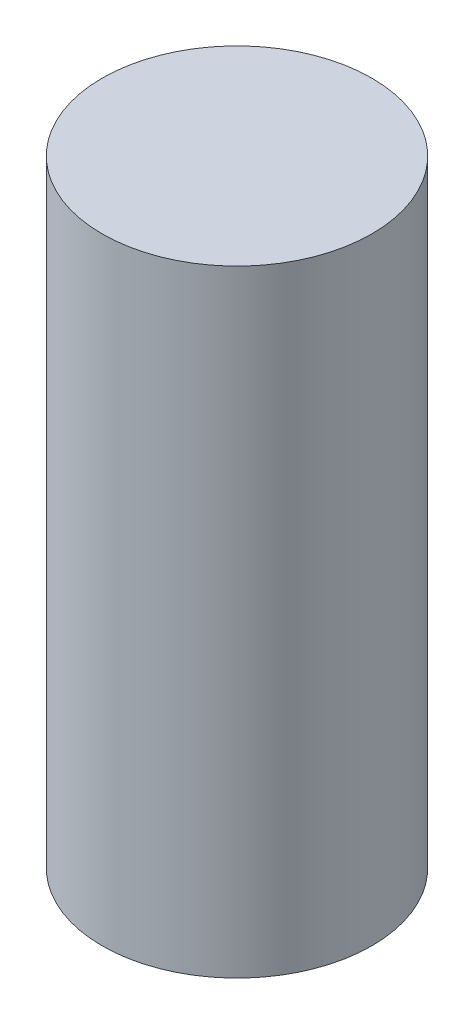
ISO-10303-21;
HEADER;
FILE_DESCRIPTION(('STEP AP214'),'2;1');
FILE_NAME('part.step','',(''),(''),'','','');
FILE_SCHEMA(('AUTOMOTIVE_DESIGN { 1 0 10303 214 1 1 1 1 }'));
ENDSEC;
DATA;
#1=APPLICATION_CONTEXT('core data for automotive mechanical design processes');
#2=APPLICATION_PROTOCOL_DEFINITION('international standard','automotive_design',2000,#1);
#3=PRODUCT_CONTEXT('',#1,'mechanical');
#4=PRODUCT('Part','Part','',(#3));
#5=PRODUCT_RELATED_PRODUCT_CATEGORY('part','',(#4));
#6=PRODUCT_DEFINITION_FORMATION('','',#4);
#7=PRODUCT_DEFINITION_CONTEXT('part definition',#1,'design');
#8=PRODUCT_DEFINITION('design','',#6,#7);
#9=PRODUCT_DEFINITION_SHAPE('','',#8);
#10=(LENGTH_UNIT() NAMED_UNIT(*) SI_UNIT(.MILLI.,.METRE.));
#11=(NAMED_UNIT(*) PLANE_ANGLE_UNIT() SI_UNIT($,.RADIAN.));
#12=(NAMED_UNIT(*) SI_UNIT($,.STERADIAN.) SOLID_ANGLE_UNIT());
#13=UNCERTAINTY_MEASURE_WITH_UNIT(LENGTH_MEASURE(1.E-05),#10,'distance_accuracy_value','');
#14=(GEOMETRIC_REPRESENTATION_CONTEXT(3) GLOBAL_UNCERTAINTY_ASSIGNED_CONTEXT((#13)) GLOBAL_UNIT_ASSIGNED_CONTEXT((#10,
#11,#12)) REPRESENTATION_CONTEXT('',''));
#15=CARTESIAN_POINT('',(0.,0.,0.));
#16=DIRECTION('',(0.,0.,1.));
#17=DIRECTION('',(1.,0.,0.));
#18=AXIS2_PLACEMENT_3D('',#15,#16,#17);
#19=CARTESIAN_POINT('',(0.,450.,-1425.));
#20=DIRECTION('',(0.,1.,0.));
#21=DIRECTION('',(0.,0.,1.));
#22=AXIS2_PLACEMENT_3D('',#19,#20,#21);
#23=CYLINDRICAL_SURFACE('',#22,87.5);
#24=CARTESIAN_POINT('',(0.,450.,-1425.));
#25=DIRECTION('',(0.,1.,0.));
#26=DIRECTION('',(0.,0.,1.));
#27=AXIS2_PLACEMENT_3D('',#24,#25,#26);
#28=CIRCLE('',#27,87.5);
#29=CARTESIAN_POINT('',(0.,450.,-1337.5));
#30=VERTEX_POINT('',#29);
#31=EDGE_CURVE('E10',#30,#30,#28,.T.);
#32=ORIENTED_EDGE('',*,*,#31,.T.);
#33=EDGE_LOOP('',(#32));
#34=FACE_BOUND('',#33,.T.);
#35=CARTESIAN_POINT('',(0.,850.,-1425.));
#36=DIRECTION('',(0.,1.,0.));
#37=DIRECTION('',(0.,0.,1.));
#38=AXIS2_PLACEMENT_3D('',#35,#36,#37);
#39=CIRCLE('',#38,87.5);
#40=CARTESIAN_POINT('',(0.,850.,-1337.5));
#41=VERTEX_POINT('',#40);
#42=EDGE_CURVE('E21',#41,#41,#39,.T.);
#43=ORIENTED_EDGE('',*,*,#42,.F.);
#44=EDGE_LOOP('',(#43));
#45=FACE_BOUND('',#44,.T.);
#46=ADVANCED_FACE('F15',(#34,#45),#23,.T.);
#47=CARTESIAN_POINT('',(0.,450.,-1425.));
#48=DIRECTION('',(0.,1.,0.));
#49=DIRECTION('',(0.,0.,1.));
#50=AXIS2_PLACEMENT_3D('',#47,#48,#49);
#51=PLANE('',#50);
#52=ORIENTED_EDGE('',*,*,#31,.F.);
#53=EDGE_LOOP('',(#52));
#54=FACE_BOUND('',#53,.T.);
#55=ADVANCED_FACE('F30',(#54),#51,.F.);
#56=CARTESIAN_POINT('',(0.,850.,-1425.));
#57=DIRECTION('',(0.,1.,0.));
#58=DIRECTION('',(0.,0.,1.));
#59=AXIS2_PLACEMENT_3D('',#56,#57,#58);
#60=PLANE('',#59);
#61=ORIENTED_EDGE('',*,*,#42,.T.);
#62=EDGE_LOOP('',(#61));
#63=FACE_BOUND('',#62,.T.);
#64=ADVANCED_FACE('F27',(#63),#60,.T.);
#65=CLOSED_SHELL('',(#46,#55,#64));
#66=MANIFOLD_SOLID_BREP('B1',#65);
#67=ADVANCED_BREP_SHAPE_REPRESENTATION('',(#18,#66),#14);
#68=SHAPE_DEFINITION_REPRESENTATION(#9,#67);
ENDSEC;
END-ISO-10303-21;
